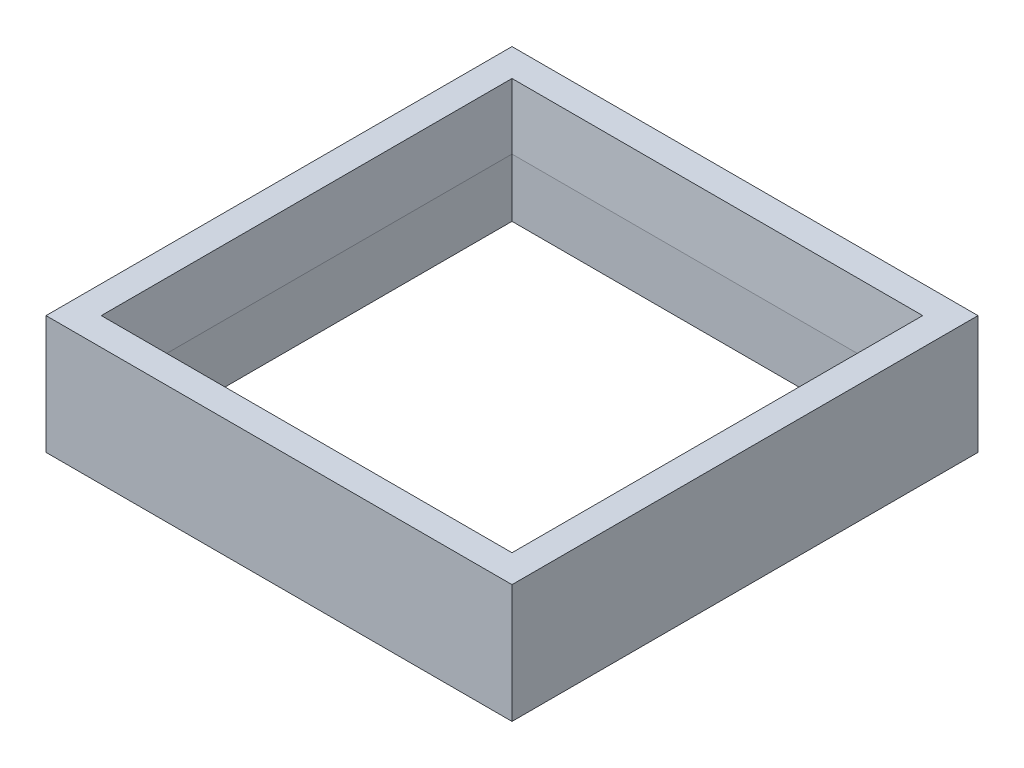
ISO-10303-21;
HEADER;
FILE_DESCRIPTION(('STEP AP214'),'2;1');
FILE_NAME('part.step','',(''),(''),'','','');
FILE_SCHEMA(('AUTOMOTIVE_DESIGN { 1 0 10303 214 1 1 1 1 }'));
ENDSEC;
DATA;
#1=APPLICATION_CONTEXT('core data for automotive mechanical design processes');
#2=APPLICATION_PROTOCOL_DEFINITION('international standard','automotive_design',2000,#1);
#3=PRODUCT_CONTEXT('',#1,'mechanical');
#4=PRODUCT('Part','Part','',(#3));
#5=PRODUCT_RELATED_PRODUCT_CATEGORY('part','',(#4));
#6=PRODUCT_DEFINITION_FORMATION('','',#4);
#7=PRODUCT_DEFINITION_CONTEXT('part definition',#1,'design');
#8=PRODUCT_DEFINITION('design','',#6,#7);
#9=PRODUCT_DEFINITION_SHAPE('','',#8);
#10=(LENGTH_UNIT() NAMED_UNIT(*) SI_UNIT(.MILLI.,.METRE.));
#11=(NAMED_UNIT(*) PLANE_ANGLE_UNIT() SI_UNIT($,.RADIAN.));
#12=(NAMED_UNIT(*) SI_UNIT($,.STERADIAN.) SOLID_ANGLE_UNIT());
#13=UNCERTAINTY_MEASURE_WITH_UNIT(LENGTH_MEASURE(1.E-05),#10,'distance_accuracy_value','');
#14=(GEOMETRIC_REPRESENTATION_CONTEXT(3) GLOBAL_UNCERTAINTY_ASSIGNED_CONTEXT((#13)) GLOBAL_UNIT_ASSIGNED_CONTEXT((#10,
#11,#12)) REPRESENTATION_CONTEXT('',''));
#15=CARTESIAN_POINT('',(0.,0.,0.));
#16=DIRECTION('',(0.,0.,1.));
#17=DIRECTION('',(1.,0.,0.));
#18=AXIS2_PLACEMENT_3D('',#15,#16,#17);
#19=CARTESIAN_POINT('',(0.,11.43,0.));
#20=DIRECTION('',(0.,1.,0.));
#21=DIRECTION('',(0.,0.,1.));
#22=AXIS2_PLACEMENT_3D('',#19,#20,#21);
#23=PLANE('',#22);
#24=DIRECTION('',(0.,0.,1.));
#25=VECTOR('',#24,1.);
#26=CARTESIAN_POINT('',(19.812,11.43,0.));
#27=LINE('',#26,#25);
#28=CARTESIAN_POINT('',(19.812,11.43,-19.812));
#29=VERTEX_POINT('',#28);
#30=CARTESIAN_POINT('',(19.812,11.43,19.812));
#31=VERTEX_POINT('',#30);
#32=EDGE_CURVE('E210',#29,#31,#27,.T.);
#33=ORIENTED_EDGE('',*,*,#32,.T.);
#34=DIRECTION('',(-1.,0.,0.));
#35=VECTOR('',#34,1.);
#36=CARTESIAN_POINT('',(0.,11.43,19.812));
#37=LINE('',#36,#35);
#38=CARTESIAN_POINT('',(-19.812,11.43,19.812));
#39=VERTEX_POINT('',#38);
#40=EDGE_CURVE('E213',#31,#39,#37,.T.);
#41=ORIENTED_EDGE('',*,*,#40,.T.);
#42=DIRECTION('',(0.,0.,-1.));
#43=VECTOR('',#42,1.);
#44=CARTESIAN_POINT('',(-19.812,11.43,0.));
#45=LINE('',#44,#43);
#46=CARTESIAN_POINT('',(-19.812,11.43,-19.812));
#47=VERTEX_POINT('',#46);
#48=EDGE_CURVE('E204',#39,#47,#45,.T.);
#49=ORIENTED_EDGE('',*,*,#48,.T.);
#50=DIRECTION('',(1.,0.,0.));
#51=VECTOR('',#50,1.);
#52=CARTESIAN_POINT('',(0.,11.43,-19.812));
#53=LINE('',#52,#51);
#54=EDGE_CURVE('E207',#47,#29,#53,.T.);
#55=ORIENTED_EDGE('',*,*,#54,.T.);
#56=EDGE_LOOP('',(#33,#41,#49,#55));
#57=FACE_BOUND('',#56,.T.);
#58=DIRECTION('',(0.,0.,1.));
#59=VECTOR('',#58,1.);
#60=CARTESIAN_POINT('',(-22.479,11.43,22.479));
#61=LINE('',#60,#59);
#62=CARTESIAN_POINT('',(-22.479,11.43,-22.479));
#63=VERTEX_POINT('',#62);
#64=CARTESIAN_POINT('',(-22.479,11.43,22.479));
#65=VERTEX_POINT('',#64);
#66=EDGE_CURVE('E159',#63,#65,#61,.T.);
#67=ORIENTED_EDGE('',*,*,#66,.T.);
#68=DIRECTION('',(1.,0.,0.));
#69=VECTOR('',#68,1.);
#70=CARTESIAN_POINT('',(22.479,11.43,22.479));
#71=LINE('',#70,#69);
#72=CARTESIAN_POINT('',(22.479,11.43,22.479));
#73=VERTEX_POINT('',#72);
#74=EDGE_CURVE('E163',#65,#73,#71,.T.);
#75=ORIENTED_EDGE('',*,*,#74,.T.);
#76=DIRECTION('',(0.,0.,-1.));
#77=VECTOR('',#76,1.);
#78=CARTESIAN_POINT('',(22.479,11.43,22.479));
#79=LINE('',#78,#77);
#80=CARTESIAN_POINT('',(22.479,11.43,-22.479));
#81=VERTEX_POINT('',#80);
#82=EDGE_CURVE('E167',#73,#81,#79,.T.);
#83=ORIENTED_EDGE('',*,*,#82,.T.);
#84=DIRECTION('',(-1.,0.,0.));
#85=VECTOR('',#84,1.);
#86=CARTESIAN_POINT('',(22.479,11.43,-22.479));
#87=LINE('',#86,#85);
#88=EDGE_CURVE('E170',#81,#63,#87,.T.);
#89=ORIENTED_EDGE('',*,*,#88,.T.);
#90=EDGE_LOOP('',(#67,#75,#83,#89));
#91=FACE_BOUND('',#90,.T.);
#92=ADVANCED_FACE('F41',(#57,#91),#23,.T.);
#93=CARTESIAN_POINT('',(0.,0.,0.));
#94=DIRECTION('',(0.,1.,0.));
#95=DIRECTION('',(0.,0.,1.));
#96=AXIS2_PLACEMENT_3D('',#93,#94,#95);
#97=PLANE('',#96);
#98=DIRECTION('',(0.,0.,1.));
#99=VECTOR('',#98,1.);
#100=CARTESIAN_POINT('',(-22.479,0.,22.479));
#101=LINE('',#100,#99);
#102=CARTESIAN_POINT('',(-22.479,0.,-22.479));
#103=VERTEX_POINT('',#102);
#104=CARTESIAN_POINT('',(-22.479,0.,22.479));
#105=VERTEX_POINT('',#104);
#106=EDGE_CURVE('E126',#103,#105,#101,.T.);
#107=ORIENTED_EDGE('',*,*,#106,.F.);
#108=DIRECTION('',(-1.,0.,0.));
#109=VECTOR('',#108,1.);
#110=CARTESIAN_POINT('',(22.479,0.,-22.479));
#111=LINE('',#110,#109);
#112=CARTESIAN_POINT('',(22.479,0.,-22.479));
#113=VERTEX_POINT('',#112);
#114=EDGE_CURVE('E164',#113,#103,#111,.T.);
#115=ORIENTED_EDGE('',*,*,#114,.F.);
#116=DIRECTION('',(0.,0.,-1.));
#117=VECTOR('',#116,1.);
#118=CARTESIAN_POINT('',(22.479,0.,22.479));
#119=LINE('',#118,#117);
#120=CARTESIAN_POINT('',(22.479,0.,22.479));
#121=VERTEX_POINT('',#120);
#122=EDGE_CURVE('E180',#121,#113,#119,.T.);
#123=ORIENTED_EDGE('',*,*,#122,.F.);
#124=DIRECTION('',(1.,0.,0.));
#125=VECTOR('',#124,1.);
#126=CARTESIAN_POINT('',(22.479,0.,22.479));
#127=LINE('',#126,#125);
#128=EDGE_CURVE('E177',#105,#121,#127,.T.);
#129=ORIENTED_EDGE('',*,*,#128,.F.);
#130=EDGE_LOOP('',(#107,#115,#123,#129));
#131=FACE_BOUND('',#130,.T.);
#132=DIRECTION('',(0.,0.,-1.));
#133=VECTOR('',#132,1.);
#134=CARTESIAN_POINT('',(19.304,0.,19.304));
#135=LINE('',#134,#133);
#136=CARTESIAN_POINT('',(19.304,0.,19.304));
#137=VERTEX_POINT('',#136);
#138=CARTESIAN_POINT('',(19.304,0.,-19.304));
#139=VERTEX_POINT('',#138);
#140=EDGE_CURVE('E123',#137,#139,#135,.T.);
#141=ORIENTED_EDGE('',*,*,#140,.T.);
#142=DIRECTION('',(-1.,0.,0.));
#143=VECTOR('',#142,1.);
#144=CARTESIAN_POINT('',(-19.304,0.,-19.304));
#145=LINE('',#144,#143);
#146=CARTESIAN_POINT('',(-19.304,0.,-19.304));
#147=VERTEX_POINT('',#146);
#148=EDGE_CURVE('E130',#139,#147,#145,.T.);
#149=ORIENTED_EDGE('',*,*,#148,.T.);
#150=DIRECTION('',(0.,0.,1.));
#151=VECTOR('',#150,1.);
#152=CARTESIAN_POINT('',(-19.304,0.,19.304));
#153=LINE('',#152,#151);
#154=CARTESIAN_POINT('',(-19.304,0.,19.304));
#155=VERTEX_POINT('',#154);
#156=EDGE_CURVE('E136',#147,#155,#153,.T.);
#157=ORIENTED_EDGE('',*,*,#156,.T.);
#158=DIRECTION('',(1.,0.,0.));
#159=VECTOR('',#158,1.);
#160=CARTESIAN_POINT('',(-19.304,0.,19.304));
#161=LINE('',#160,#159);
#162=EDGE_CURVE('E140',#155,#137,#161,.T.);
#163=ORIENTED_EDGE('',*,*,#162,.T.);
#164=EDGE_LOOP('',(#141,#149,#157,#163));
#165=FACE_BOUND('',#164,.T.);
#166=ADVANCED_FACE('F138',(#131,#165),#97,.F.);
#167=CARTESIAN_POINT('',(-22.479,11.43,22.479));
#168=DIRECTION('',(1.,0.,0.));
#169=DIRECTION('',(0.,0.,-1.));
#170=AXIS2_PLACEMENT_3D('',#167,#168,#169);
#171=PLANE('',#170);
#172=ORIENTED_EDGE('',*,*,#106,.T.);
#173=DIRECTION('',(0.,-1.,0.));
#174=VECTOR('',#173,1.);
#175=CARTESIAN_POINT('',(-22.479,11.43,22.479));
#176=LINE('',#175,#174);
#177=EDGE_CURVE('E196',#65,#105,#176,.T.);
#178=ORIENTED_EDGE('',*,*,#177,.F.);
#179=ORIENTED_EDGE('',*,*,#66,.F.);
#180=DIRECTION('',(0.,-1.,0.));
#181=VECTOR('',#180,1.);
#182=CARTESIAN_POINT('',(-22.479,11.43,-22.479));
#183=LINE('',#182,#181);
#184=EDGE_CURVE('E173',#63,#103,#183,.T.);
#185=ORIENTED_EDGE('',*,*,#184,.T.);
#186=EDGE_LOOP('',(#172,#178,#179,#185));
#187=FACE_BOUND('',#186,.T.);
#188=ADVANCED_FACE('F260',(#187),#171,.F.);
#189=CARTESIAN_POINT('',(22.479,11.43,22.479));
#190=DIRECTION('',(0.,0.,-1.));
#191=DIRECTION('',(-1.,0.,0.));
#192=AXIS2_PLACEMENT_3D('',#189,#190,#191);
#193=PLANE('',#192);
#194=ORIENTED_EDGE('',*,*,#128,.T.);
#195=DIRECTION('',(0.,-1.,0.));
#196=VECTOR('',#195,1.);
#197=CARTESIAN_POINT('',(22.479,11.43,22.479));
#198=LINE('',#197,#196);
#199=EDGE_CURVE('E192',#73,#121,#198,.T.);
#200=ORIENTED_EDGE('',*,*,#199,.F.);
#201=ORIENTED_EDGE('',*,*,#74,.F.);
#202=ORIENTED_EDGE('',*,*,#177,.T.);
#203=EDGE_LOOP('',(#194,#200,#201,#202));
#204=FACE_BOUND('',#203,.T.);
#205=ADVANCED_FACE('F263',(#204),#193,.F.);
#206=CARTESIAN_POINT('',(22.479,11.43,22.479));
#207=DIRECTION('',(-1.,0.,0.));
#208=DIRECTION('',(0.,0.,1.));
#209=AXIS2_PLACEMENT_3D('',#206,#207,#208);
#210=PLANE('',#209);
#211=ORIENTED_EDGE('',*,*,#122,.T.);
#212=DIRECTION('',(0.,-1.,0.));
#213=VECTOR('',#212,1.);
#214=CARTESIAN_POINT('',(22.479,11.43,-22.479));
#215=LINE('',#214,#213);
#216=EDGE_CURVE('E188',#81,#113,#215,.T.);
#217=ORIENTED_EDGE('',*,*,#216,.F.);
#218=ORIENTED_EDGE('',*,*,#82,.F.);
#219=ORIENTED_EDGE('',*,*,#199,.T.);
#220=EDGE_LOOP('',(#211,#217,#218,#219));
#221=FACE_BOUND('',#220,.T.);
#222=ADVANCED_FACE('F268',(#221),#210,.F.);
#223=CARTESIAN_POINT('',(22.479,11.43,-22.479));
#224=DIRECTION('',(0.,0.,1.));
#225=DIRECTION('',(1.,0.,0.));
#226=AXIS2_PLACEMENT_3D('',#223,#224,#225);
#227=PLANE('',#226);
#228=ORIENTED_EDGE('',*,*,#114,.T.);
#229=ORIENTED_EDGE('',*,*,#184,.F.);
#230=ORIENTED_EDGE('',*,*,#88,.F.);
#231=ORIENTED_EDGE('',*,*,#216,.T.);
#232=EDGE_LOOP('',(#228,#229,#230,#231));
#233=FACE_BOUND('',#232,.T.);
#234=ADVANCED_FACE('F271',(#233),#227,.F.);
#235=CARTESIAN_POINT('',(19.304,11.43,19.304));
#236=DIRECTION('',(-1.,0.,0.));
#237=DIRECTION('',(0.,0.,1.));
#238=AXIS2_PLACEMENT_3D('',#235,#236,#237);
#239=PLANE('',#238);
#240=DIRECTION('',(0.,-1.,0.));
#241=VECTOR('',#240,1.);
#242=CARTESIAN_POINT('',(19.304,11.43,19.304));
#243=LINE('',#242,#241);
#244=CARTESIAN_POINT('',(19.304,5.62353343019723,19.304));
#245=VERTEX_POINT('',#244);
#246=EDGE_CURVE('E151',#245,#137,#243,.T.);
#247=ORIENTED_EDGE('',*,*,#246,.F.);
#248=DIRECTION('',(0.,0.,-1.));
#249=VECTOR('',#248,1.);
#250=CARTESIAN_POINT('',(19.304,5.62353343019723,19.304));
#251=LINE('',#250,#249);
#252=CARTESIAN_POINT('',(19.304,5.62353343019723,-19.304));
#253=VERTEX_POINT('',#252);
#254=EDGE_CURVE('E67',#245,#253,#251,.T.);
#255=ORIENTED_EDGE('',*,*,#254,.T.);
#256=DIRECTION('',(0.,-1.,0.));
#257=VECTOR('',#256,1.);
#258=CARTESIAN_POINT('',(19.304,11.43,-19.304));
#259=LINE('',#258,#257);
#260=EDGE_CURVE('E119',#253,#139,#259,.T.);
#261=ORIENTED_EDGE('',*,*,#260,.T.);
#262=ORIENTED_EDGE('',*,*,#140,.F.);
#263=EDGE_LOOP('',(#247,#255,#261,#262));
#264=FACE_BOUND('',#263,.T.);
#265=ADVANCED_FACE('F121',(#264),#239,.T.);
#266=CARTESIAN_POINT('',(-19.304,11.43,-19.304));
#267=DIRECTION('',(0.,0.,1.));
#268=DIRECTION('',(1.,0.,0.));
#269=AXIS2_PLACEMENT_3D('',#266,#267,#268);
#270=PLANE('',#269);
#271=ORIENTED_EDGE('',*,*,#260,.F.);
#272=DIRECTION('',(-1.,0.,0.));
#273=VECTOR('',#272,1.);
#274=CARTESIAN_POINT('',(-19.304,5.62353343019723,-19.304));
#275=LINE('',#274,#273);
#276=CARTESIAN_POINT('',(-19.304,5.62353343019723,-19.304));
#277=VERTEX_POINT('',#276);
#278=EDGE_CURVE('E52',#253,#277,#275,.T.);
#279=ORIENTED_EDGE('',*,*,#278,.T.);
#280=DIRECTION('',(0.,-1.,0.));
#281=VECTOR('',#280,1.);
#282=CARTESIAN_POINT('',(-19.304,11.43,-19.304));
#283=LINE('',#282,#281);
#284=EDGE_CURVE('E127',#277,#147,#283,.T.);
#285=ORIENTED_EDGE('',*,*,#284,.T.);
#286=ORIENTED_EDGE('',*,*,#148,.F.);
#287=EDGE_LOOP('',(#271,#279,#285,#286));
#288=FACE_BOUND('',#287,.T.);
#289=ADVANCED_FACE('F131',(#288),#270,.T.);
#290=CARTESIAN_POINT('',(-19.304,11.43,19.304));
#291=DIRECTION('',(1.,0.,0.));
#292=DIRECTION('',(0.,0.,-1.));
#293=AXIS2_PLACEMENT_3D('',#290,#291,#292);
#294=PLANE('',#293);
#295=ORIENTED_EDGE('',*,*,#284,.F.);
#296=DIRECTION('',(0.,0.,1.));
#297=VECTOR('',#296,1.);
#298=CARTESIAN_POINT('',(-19.304,5.62353343019723,19.304));
#299=LINE('',#298,#297);
#300=CARTESIAN_POINT('',(-19.304,5.62353343019723,19.304));
#301=VERTEX_POINT('',#300);
#302=EDGE_CURVE('E11',#277,#301,#299,.T.);
#303=ORIENTED_EDGE('',*,*,#302,.T.);
#304=DIRECTION('',(0.,-1.,0.));
#305=VECTOR('',#304,1.);
#306=CARTESIAN_POINT('',(-19.304,11.43,19.304));
#307=LINE('',#306,#305);
#308=EDGE_CURVE('E154',#301,#155,#307,.T.);
#309=ORIENTED_EDGE('',*,*,#308,.T.);
#310=ORIENTED_EDGE('',*,*,#156,.F.);
#311=EDGE_LOOP('',(#295,#303,#309,#310));
#312=FACE_BOUND('',#311,.T.);
#313=ADVANCED_FACE('F244',(#312),#294,.T.);
#314=CARTESIAN_POINT('',(-19.304,11.43,19.304));
#315=DIRECTION('',(0.,0.,-1.));
#316=DIRECTION('',(-1.,0.,0.));
#317=AXIS2_PLACEMENT_3D('',#314,#315,#316);
#318=PLANE('',#317);
#319=ORIENTED_EDGE('',*,*,#308,.F.);
#320=DIRECTION('',(1.,0.,0.));
#321=VECTOR('',#320,1.);
#322=CARTESIAN_POINT('',(-19.304,5.62353343019723,19.304));
#323=LINE('',#322,#321);
#324=EDGE_CURVE('E200',#301,#245,#323,.T.);
#325=ORIENTED_EDGE('',*,*,#324,.T.);
#326=ORIENTED_EDGE('',*,*,#246,.T.);
#327=ORIENTED_EDGE('',*,*,#162,.F.);
#328=EDGE_LOOP('',(#319,#325,#326,#327));
#329=FACE_BOUND('',#328,.T.);
#330=ADVANCED_FACE('F246',(#329),#318,.T.);
#331=CARTESIAN_POINT('',(-19.304,5.62353343019723,-19.304));
#332=DIRECTION('',(0.,-0.0871557427476583,-0.996194698091745));
#333=DIRECTION('',(-1.,0.,0.));
#334=AXIS2_PLACEMENT_3D('',#331,#332,#333);
#335=PLANE('',#334);
#336=DIRECTION('',(0.0868265938642477,0.992432509138967,-0.0868265938642477));
#337=VECTOR('',#336,1.);
#338=CARTESIAN_POINT('',(19.012939793421,2.2967000457467,-19.012939793421));
#339=LINE('',#338,#337);
#340=EDGE_CURVE('E145',#29,#253,#339,.F.);
#341=ORIENTED_EDGE('',*,*,#340,.F.);
#342=ORIENTED_EDGE('',*,*,#54,.F.);
#343=DIRECTION('',(-0.0868265938642477,0.992432509138967,-0.0868265938642477));
#344=VECTOR('',#343,1.);
#345=CARTESIAN_POINT('',(-19.304,5.62353343019723,-19.304));
#346=LINE('',#345,#344);
#347=EDGE_CURVE('E46',#277,#47,#346,.T.);
#348=ORIENTED_EDGE('',*,*,#347,.F.);
#349=ORIENTED_EDGE('',*,*,#278,.F.);
#350=EDGE_LOOP('',(#341,#342,#348,#349));
#351=FACE_BOUND('',#350,.T.);
#352=ADVANCED_FACE('F44',(#351),#335,.F.);
#353=CARTESIAN_POINT('',(-19.304,5.62353343019723,19.304));
#354=DIRECTION('',(-0.996194698091745,-0.0871557427476583,0.));
#355=DIRECTION('',(0.,0.,1.));
#356=AXIS2_PLACEMENT_3D('',#353,#354,#355);
#357=PLANE('',#356);
#358=ORIENTED_EDGE('',*,*,#347,.T.);
#359=ORIENTED_EDGE('',*,*,#48,.F.);
#360=DIRECTION('',(0.0868265938642477,-0.992432509138967,-0.0868265938642477));
#361=VECTOR('',#360,1.);
#362=CARTESIAN_POINT('',(-19.304,5.62353343019723,19.304));
#363=LINE('',#362,#361);
#364=EDGE_CURVE('E224',#301,#39,#363,.F.);
#365=ORIENTED_EDGE('',*,*,#364,.F.);
#366=ORIENTED_EDGE('',*,*,#302,.F.);
#367=EDGE_LOOP('',(#358,#359,#365,#366));
#368=FACE_BOUND('',#367,.T.);
#369=ADVANCED_FACE('F240',(#368),#357,.F.);
#370=CARTESIAN_POINT('',(19.304,5.62353343019723,19.304));
#371=DIRECTION('',(0.996194698091745,-0.0871557427476583,0.));
#372=DIRECTION('',(0.,0.,-1.));
#373=AXIS2_PLACEMENT_3D('',#370,#371,#372);
#374=PLANE('',#373);
#375=ORIENTED_EDGE('',*,*,#340,.T.);
#376=ORIENTED_EDGE('',*,*,#254,.F.);
#377=DIRECTION('',(0.0868265938642477,0.992432509138967,0.0868265938642477));
#378=VECTOR('',#377,1.);
#379=CARTESIAN_POINT('',(19.012939793421,2.2967000457467,19.012939793421));
#380=LINE('',#379,#378);
#381=EDGE_CURVE('E221',#31,#245,#380,.F.);
#382=ORIENTED_EDGE('',*,*,#381,.F.);
#383=ORIENTED_EDGE('',*,*,#32,.F.);
#384=EDGE_LOOP('',(#375,#376,#382,#383));
#385=FACE_BOUND('',#384,.T.);
#386=ADVANCED_FACE('F231',(#385),#374,.F.);
#387=CARTESIAN_POINT('',(-19.304,5.62353343019723,19.304));
#388=DIRECTION('',(0.,-0.0871557427476583,0.996194698091745));
#389=DIRECTION('',(1.,0.,0.));
#390=AXIS2_PLACEMENT_3D('',#387,#388,#389);
#391=PLANE('',#390);
#392=ORIENTED_EDGE('',*,*,#364,.T.);
#393=ORIENTED_EDGE('',*,*,#40,.F.);
#394=ORIENTED_EDGE('',*,*,#381,.T.);
#395=ORIENTED_EDGE('',*,*,#324,.F.);
#396=EDGE_LOOP('',(#392,#393,#394,#395));
#397=FACE_BOUND('',#396,.T.);
#398=ADVANCED_FACE('F248',(#397),#391,.F.);
#399=CLOSED_SHELL('',(#92,#166,#188,#205,#222,#234,#265,#289,#313,#330,#352,#369,#386,#398));
#400=MANIFOLD_SOLID_BREP('B2',#399);
#401=ADVANCED_BREP_SHAPE_REPRESENTATION('',(#18,#400),#14);
#402=SHAPE_DEFINITION_REPRESENTATION(#9,#401);
ENDSEC;
END-ISO-10303-21;
